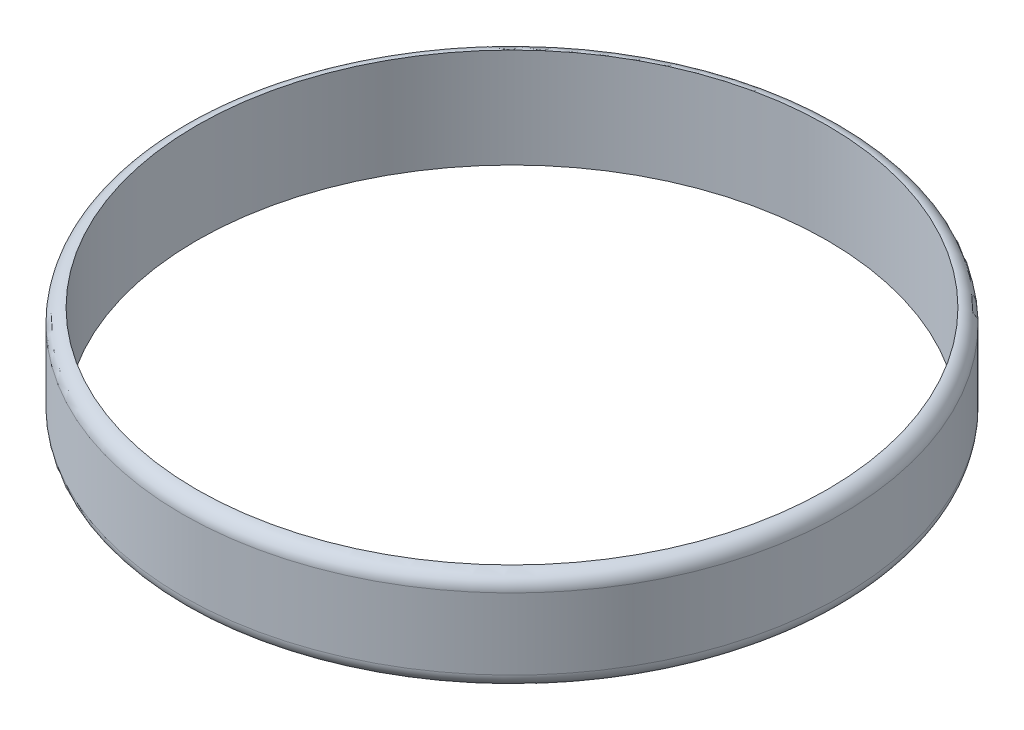
ISO-10303-21;
HEADER;
FILE_DESCRIPTION(('STEP AP214'),'2;1');
FILE_NAME('part.step','',(''),(''),'','','');
FILE_SCHEMA(('AUTOMOTIVE_DESIGN { 1 0 10303 214 1 1 1 1 }'));
ENDSEC;
DATA;
#1=APPLICATION_CONTEXT('core data for automotive mechanical design processes');
#2=APPLICATION_PROTOCOL_DEFINITION('international standard','automotive_design',2000,#1);
#3=PRODUCT_CONTEXT('',#1,'mechanical');
#4=PRODUCT('Part','Part','',(#3));
#5=PRODUCT_RELATED_PRODUCT_CATEGORY('part','',(#4));
#6=PRODUCT_DEFINITION_FORMATION('','',#4);
#7=PRODUCT_DEFINITION_CONTEXT('part definition',#1,'design');
#8=PRODUCT_DEFINITION('design','',#6,#7);
#9=PRODUCT_DEFINITION_SHAPE('','',#8);
#10=(LENGTH_UNIT() NAMED_UNIT(*) SI_UNIT(.MILLI.,.METRE.));
#11=(NAMED_UNIT(*) PLANE_ANGLE_UNIT() SI_UNIT($,.RADIAN.));
#12=(NAMED_UNIT(*) SI_UNIT($,.STERADIAN.) SOLID_ANGLE_UNIT());
#13=UNCERTAINTY_MEASURE_WITH_UNIT(LENGTH_MEASURE(1.E-05),#10,'distance_accuracy_value','');
#14=(GEOMETRIC_REPRESENTATION_CONTEXT(3) GLOBAL_UNCERTAINTY_ASSIGNED_CONTEXT((#13)) GLOBAL_UNIT_ASSIGNED_CONTEXT((#10,
#11,#12)) REPRESENTATION_CONTEXT('',''));
#15=CARTESIAN_POINT('',(0.,0.,0.));
#16=DIRECTION('',(0.,0.,1.));
#17=DIRECTION('',(1.,0.,0.));
#18=AXIS2_PLACEMENT_3D('',#15,#16,#17);
#19=CARTESIAN_POINT('',(0.,10.5,0.));
#20=DIRECTION('',(0.,-1.,0.));
#21=DIRECTION('',(0.,0.,-1.));
#22=AXIS2_PLACEMENT_3D('',#19,#20,#21);
#23=CYLINDRICAL_SURFACE('',#22,69.5);
#24=CARTESIAN_POINT('',(0.,-7.5,0.));
#25=DIRECTION('',(0.,1.,0.));
#26=DIRECTION('',(0.,0.,1.));
#27=AXIS2_PLACEMENT_3D('',#24,#25,#26);
#28=CIRCLE('',#27,69.5);
#29=CARTESIAN_POINT('',(0.,-7.50000000000001,-69.5));
#30=VERTEX_POINT('',#29);
#31=EDGE_CURVE('E10',#30,#30,#28,.T.);
#32=CARTESIAN_POINT('',(0.,7.5,0.));
#33=DIRECTION('',(0.,1.,0.));
#34=DIRECTION('',(0.,0.,1.));
#35=AXIS2_PLACEMENT_3D('',#32,#33,#34);
#36=CIRCLE('',#35,69.5);
#37=CARTESIAN_POINT('',(0.,7.5,-69.5));
#38=VERTEX_POINT('',#37);
#39=EDGE_CURVE('E44',#38,#38,#36,.F.);
#40=CARTESIAN_POINT('',(0.,-7.50000000000001,-69.5));
#41=CARTESIAN_POINT('',(0.,-7.34375,-69.5));
#42=CARTESIAN_POINT('',(0.,-7.1875,-69.5));
#43=CARTESIAN_POINT('',(0.,-6.875,-69.5));
#44=CARTESIAN_POINT('',(0.,-6.71875,-69.5));
#45=CARTESIAN_POINT('',(0.,-6.40625,-69.5));
#46=CARTESIAN_POINT('',(0.,-6.25,-69.5));
#47=CARTESIAN_POINT('',(0.,-5.9375,-69.5));
#48=CARTESIAN_POINT('',(0.,-5.78125,-69.5));
#49=CARTESIAN_POINT('',(0.,-5.46875,-69.5));
#50=CARTESIAN_POINT('',(0.,-5.3125,-69.5));
#51=CARTESIAN_POINT('',(0.,-5.,-69.5));
#52=CARTESIAN_POINT('',(0.,-4.84375,-69.5));
#53=CARTESIAN_POINT('',(0.,-4.53125000000001,-69.5));
#54=CARTESIAN_POINT('',(0.,-4.375,-69.5));
#55=CARTESIAN_POINT('',(0.,-4.06250000000001,-69.5));
#56=CARTESIAN_POINT('',(0.,-3.90625000000001,-69.5));
#57=CARTESIAN_POINT('',(0.,-3.59375,-69.5));
#58=CARTESIAN_POINT('',(0.,-3.4375,-69.5));
#59=CARTESIAN_POINT('',(0.,-3.125,-69.5));
#60=CARTESIAN_POINT('',(0.,-2.96875,-69.5));
#61=CARTESIAN_POINT('',(0.,-2.65625,-69.5));
#62=CARTESIAN_POINT('',(0.,-2.5,-69.5));
#63=CARTESIAN_POINT('',(0.,-2.1875,-69.5));
#64=CARTESIAN_POINT('',(0.,-2.03125,-69.5));
#65=CARTESIAN_POINT('',(0.,-1.71875,-69.5));
#66=CARTESIAN_POINT('',(0.,-1.5625,-69.5));
#67=CARTESIAN_POINT('',(0.,-1.25,-69.5));
#68=CARTESIAN_POINT('',(0.,-1.09375,-69.5));
#69=CARTESIAN_POINT('',(0.,-0.781250000000004,-69.5));
#70=CARTESIAN_POINT('',(0.,-0.625000000000004,-69.5));
#71=CARTESIAN_POINT('',(0.,-0.312500000000004,-69.5));
#72=CARTESIAN_POINT('',(0.,-0.156250000000004,-69.5));
#73=CARTESIAN_POINT('',(0.,0.156249999999997,-69.5));
#74=CARTESIAN_POINT('',(0.,0.312499999999997,-69.5));
#75=CARTESIAN_POINT('',(0.,0.624999999999997,-69.5));
#76=CARTESIAN_POINT('',(0.,0.781249999999997,-69.5));
#77=CARTESIAN_POINT('',(0.,1.09375,-69.5));
#78=CARTESIAN_POINT('',(0.,1.25,-69.5));
#79=CARTESIAN_POINT('',(0.,1.5625,-69.5));
#80=CARTESIAN_POINT('',(0.,1.71875,-69.5));
#81=CARTESIAN_POINT('',(0.,2.03125,-69.5));
#82=CARTESIAN_POINT('',(0.,2.1875,-69.5));
#83=CARTESIAN_POINT('',(0.,2.5,-69.5));
#84=CARTESIAN_POINT('',(0.,2.65625,-69.5));
#85=CARTESIAN_POINT('',(0.,2.96875,-69.5));
#86=CARTESIAN_POINT('',(0.,3.125,-69.5));
#87=CARTESIAN_POINT('',(0.,3.4375,-69.5));
#88=CARTESIAN_POINT('',(0.,3.59375,-69.5));
#89=CARTESIAN_POINT('',(0.,3.90625,-69.5));
#90=CARTESIAN_POINT('',(0.,4.0625,-69.5));
#91=CARTESIAN_POINT('',(0.,4.375,-69.5));
#92=CARTESIAN_POINT('',(0.,4.53125,-69.5));
#93=CARTESIAN_POINT('',(0.,4.84375,-69.5));
#94=CARTESIAN_POINT('',(0.,5.,-69.5));
#95=CARTESIAN_POINT('',(0.,5.3125,-69.5));
#96=CARTESIAN_POINT('',(0.,5.46875,-69.5));
#97=CARTESIAN_POINT('',(0.,5.78125,-69.5));
#98=CARTESIAN_POINT('',(0.,5.9375,-69.5));
#99=CARTESIAN_POINT('',(0.,6.25,-69.5));
#100=CARTESIAN_POINT('',(0.,6.40625,-69.5));
#101=CARTESIAN_POINT('',(0.,6.71875,-69.5));
#102=CARTESIAN_POINT('',(0.,6.875,-69.5));
#103=CARTESIAN_POINT('',(0.,7.1875,-69.5));
#104=CARTESIAN_POINT('',(0.,7.34375,-69.5));
#105=CARTESIAN_POINT('',(0.,7.5,-69.5));
#106=B_SPLINE_CURVE_WITH_KNOTS('',3,(#40,#41,#42,#43,#44,#45,#46,#47,#48,#49,#50,#51,#52,#53,
#54,#55,#56,#57,#58,#59,#60,#61,#62,#63,#64,#65,#66,#67,#68,#69,#70,#71,#72,#73,#74,#75,#76,#77,
#78,#79,#80,#81,#82,#83,#84,#85,#86,#87,#88,#89,#90,#91,#92,#93,#94,#95,#96,#97,#98,#99,#100,
#101,#102,#103,#104,#105),.UNSPECIFIED.,.F.,.F.,(4,2,2,2,2,2,2,2,2,2,2,2,2,2,2,2,2,2,2,2,2,2,2,
2,2,2,2,2,2,2,2,2,4),(0.,0.46875,0.937500000000001,1.40625,1.875,2.34375,2.8125,3.28125,3.75,
4.21875,4.6875,5.15625,5.625,6.09375,6.5625,7.03125,7.5,7.96875,8.4375,8.90625,9.375,9.84375,
10.3125,10.78125,11.25,11.71875,12.1875,12.65625,13.125,13.59375,14.0625,14.53125,15.),.UNSPECIFIED.);
#107=EDGE_CURVE('BSEAM37',#30,#38,#106,.T.);
#108=ORIENTED_EDGE('',*,*,#31,.T.);
#109=ORIENTED_EDGE('',*,*,#39,.T.);
#110=ORIENTED_EDGE('',*,*,#107,.T.);
#111=ORIENTED_EDGE('',*,*,#107,.F.);
#112=EDGE_LOOP('',(#108,#110,#109,#111));
#113=FACE_BOUND('',#112,.T.);
#114=ADVANCED_FACE('F37',(#113),#23,.T.);
#115=CARTESIAN_POINT('',(0.,10.5,0.));
#116=DIRECTION('',(0.,-1.,0.));
#117=DIRECTION('',(0.,0.,-1.));
#118=AXIS2_PLACEMENT_3D('',#115,#116,#117);
#119=CYLINDRICAL_SURFACE('',#118,66.5);
#120=CARTESIAN_POINT('',(0.,10.5,0.));
#121=DIRECTION('',(0.,1.,0.));
#122=DIRECTION('',(0.,0.,1.));
#123=AXIS2_PLACEMENT_3D('',#120,#121,#122);
#124=CIRCLE('',#123,66.5);
#125=CARTESIAN_POINT('',(0.,10.5,-66.5));
#126=VERTEX_POINT('',#125);
#127=EDGE_CURVE('E48',#126,#126,#124,.T.);
#128=CARTESIAN_POINT('',(0.,-10.5,0.));
#129=DIRECTION('',(0.,1.,0.));
#130=DIRECTION('',(0.,0.,1.));
#131=AXIS2_PLACEMENT_3D('',#128,#129,#130);
#132=CIRCLE('',#131,66.5);
#133=CARTESIAN_POINT('',(0.,-10.5,-66.5));
#134=VERTEX_POINT('',#133);
#135=EDGE_CURVE('E52',#134,#134,#132,.T.);
#136=CARTESIAN_POINT('',(0.,10.5,-66.5));
#137=CARTESIAN_POINT('',(0.,10.28125,-66.5));
#138=CARTESIAN_POINT('',(0.,10.0625,-66.5));
#139=CARTESIAN_POINT('',(0.,9.625,-66.5));
#140=CARTESIAN_POINT('',(0.,9.40625,-66.5));
#141=CARTESIAN_POINT('',(0.,8.96875,-66.5));
#142=CARTESIAN_POINT('',(0.,8.75,-66.5));
#143=CARTESIAN_POINT('',(0.,8.3125,-66.5));
#144=CARTESIAN_POINT('',(0.,8.09375,-66.5));
#145=CARTESIAN_POINT('',(0.,7.65625,-66.5));
#146=CARTESIAN_POINT('',(0.,7.4375,-66.5));
#147=CARTESIAN_POINT('',(0.,7.,-66.5));
#148=CARTESIAN_POINT('',(0.,6.78125,-66.5));
#149=CARTESIAN_POINT('',(0.,6.34375,-66.5));
#150=CARTESIAN_POINT('',(0.,6.125,-66.5));
#151=CARTESIAN_POINT('',(0.,5.6875,-66.5));
#152=CARTESIAN_POINT('',(0.,5.46875,-66.5));
#153=CARTESIAN_POINT('',(0.,5.03125,-66.5));
#154=CARTESIAN_POINT('',(0.,4.8125,-66.5));
#155=CARTESIAN_POINT('',(0.,4.375,-66.5));
#156=CARTESIAN_POINT('',(0.,4.15625,-66.5));
#157=CARTESIAN_POINT('',(0.,3.71875,-66.5));
#158=CARTESIAN_POINT('',(0.,3.5,-66.5));
#159=CARTESIAN_POINT('',(0.,3.0625,-66.5));
#160=CARTESIAN_POINT('',(0.,2.84375,-66.5));
#161=CARTESIAN_POINT('',(0.,2.40625,-66.5));
#162=CARTESIAN_POINT('',(0.,2.1875,-66.5));
#163=CARTESIAN_POINT('',(0.,1.75,-66.5));
#164=CARTESIAN_POINT('',(0.,1.53125,-66.5));
#165=CARTESIAN_POINT('',(0.,1.09375,-66.5));
#166=CARTESIAN_POINT('',(0.,0.875000000000001,-66.5));
#167=CARTESIAN_POINT('',(0.,0.4375,-66.5));
#168=CARTESIAN_POINT('',(0.,0.21875,-66.5));
#169=CARTESIAN_POINT('',(0.,-0.21875,-66.5));
#170=CARTESIAN_POINT('',(0.,-0.4375,-66.5));
#171=CARTESIAN_POINT('',(0.,-0.875000000000001,-66.5));
#172=CARTESIAN_POINT('',(0.,-1.09375,-66.5));
#173=CARTESIAN_POINT('',(0.,-1.53125,-66.5));
#174=CARTESIAN_POINT('',(0.,-1.75,-66.5));
#175=CARTESIAN_POINT('',(0.,-2.1875,-66.5));
#176=CARTESIAN_POINT('',(0.,-2.40625,-66.5));
#177=CARTESIAN_POINT('',(0.,-2.84375,-66.5));
#178=CARTESIAN_POINT('',(0.,-3.0625,-66.5));
#179=CARTESIAN_POINT('',(0.,-3.5,-66.5));
#180=CARTESIAN_POINT('',(0.,-3.71875,-66.5));
#181=CARTESIAN_POINT('',(0.,-4.15625,-66.5));
#182=CARTESIAN_POINT('',(0.,-4.375,-66.5));
#183=CARTESIAN_POINT('',(0.,-4.8125,-66.5));
#184=CARTESIAN_POINT('',(0.,-5.03125,-66.5));
#185=CARTESIAN_POINT('',(0.,-5.46875,-66.5));
#186=CARTESIAN_POINT('',(0.,-5.6875,-66.5));
#187=CARTESIAN_POINT('',(0.,-6.125,-66.5));
#188=CARTESIAN_POINT('',(0.,-6.34375,-66.5));
#189=CARTESIAN_POINT('',(0.,-6.78125,-66.5));
#190=CARTESIAN_POINT('',(0.,-7.,-66.5));
#191=CARTESIAN_POINT('',(0.,-7.4375,-66.5));
#192=CARTESIAN_POINT('',(0.,-7.65625,-66.5));
#193=CARTESIAN_POINT('',(0.,-8.09375,-66.5));
#194=CARTESIAN_POINT('',(0.,-8.3125,-66.5));
#195=CARTESIAN_POINT('',(0.,-8.75,-66.5));
#196=CARTESIAN_POINT('',(0.,-8.96875,-66.5));
#197=CARTESIAN_POINT('',(0.,-9.40625,-66.5));
#198=CARTESIAN_POINT('',(0.,-9.625,-66.5));
#199=CARTESIAN_POINT('',(0.,-10.0625,-66.5));
#200=CARTESIAN_POINT('',(0.,-10.28125,-66.5));
#201=CARTESIAN_POINT('',(0.,-10.5,-66.5));
#202=B_SPLINE_CURVE_WITH_KNOTS('',3,(#136,#137,#138,#139,#140,#141,#142,#143,#144,#145,#146,
#147,#148,#149,#150,#151,#152,#153,#154,#155,#156,#157,#158,#159,#160,#161,#162,#163,#164,#165,
#166,#167,#168,#169,#170,#171,#172,#173,#174,#175,#176,#177,#178,#179,#180,#181,#182,#183,#184,
#185,#186,#187,#188,#189,#190,#191,#192,#193,#194,#195,#196,#197,#198,#199,#200,#201),
.UNSPECIFIED.,.F.,.F.,(4,2,2,2,2,2,2,2,2,2,2,2,2,2,2,2,2,2,2,2,2,2,2,2,2,2,2,2,2,2,2,2,4),(0.,
0.656250000000001,1.3125,1.96875,2.625,3.28125,3.9375,4.59375,5.25,5.90625,6.5625,7.21875,7.875,
8.53125,9.1875,9.84375,10.5,11.15625,11.8125,12.46875,13.125,13.78125,14.4375,15.09375,15.75,
16.40625,17.0625,17.71875,18.375,19.03125,19.6875,20.34375,21.),.UNSPECIFIED.);
#203=EDGE_CURVE('BSEAM61',#126,#134,#202,.T.);
#204=ORIENTED_EDGE('',*,*,#127,.T.);
#205=ORIENTED_EDGE('',*,*,#135,.F.);
#206=ORIENTED_EDGE('',*,*,#203,.T.);
#207=ORIENTED_EDGE('',*,*,#203,.F.);
#208=EDGE_LOOP('',(#204,#206,#205,#207));
#209=FACE_BOUND('',#208,.T.);
#210=ADVANCED_FACE('F61',(#209),#119,.F.);
#211=CARTESIAN_POINT('',(0.,-7.5,0.));
#212=DIRECTION('',(0.,1.,0.));
#213=DIRECTION('',(0.,0.,1.));
#214=AXIS2_PLACEMENT_3D('',#211,#212,#213);
#215=TOROIDAL_SURFACE('',#214,66.5,3.);
#216=ORIENTED_EDGE('',*,*,#135,.T.);
#217=EDGE_LOOP('',(#216));
#218=FACE_BOUND('',#217,.T.);
#219=ORIENTED_EDGE('',*,*,#31,.F.);
#220=EDGE_LOOP('',(#219));
#221=FACE_BOUND('',#220,.T.);
#222=ADVANCED_FACE('F58',(#218,#221),#215,.T.);
#223=CARTESIAN_POINT('',(0.,7.5,0.));
#224=DIRECTION('',(0.,1.,0.));
#225=DIRECTION('',(0.,0.,1.));
#226=AXIS2_PLACEMENT_3D('',#223,#224,#225);
#227=TOROIDAL_SURFACE('',#226,66.5,3.);
#228=ORIENTED_EDGE('',*,*,#39,.F.);
#229=EDGE_LOOP('',(#228));
#230=FACE_BOUND('',#229,.T.);
#231=ORIENTED_EDGE('',*,*,#127,.F.);
#232=EDGE_LOOP('',(#231));
#233=FACE_BOUND('',#232,.T.);
#234=ADVANCED_FACE('F39',(#230,#233),#227,.T.);
#235=CLOSED_SHELL('',(#114,#210,#222,#234));
#236=MANIFOLD_SOLID_BREP('B2',#235);
#237=ADVANCED_BREP_SHAPE_REPRESENTATION('',(#18,#236),#14);
#238=SHAPE_DEFINITION_REPRESENTATION(#9,#237);
ENDSEC;
END-ISO-10303-21;
